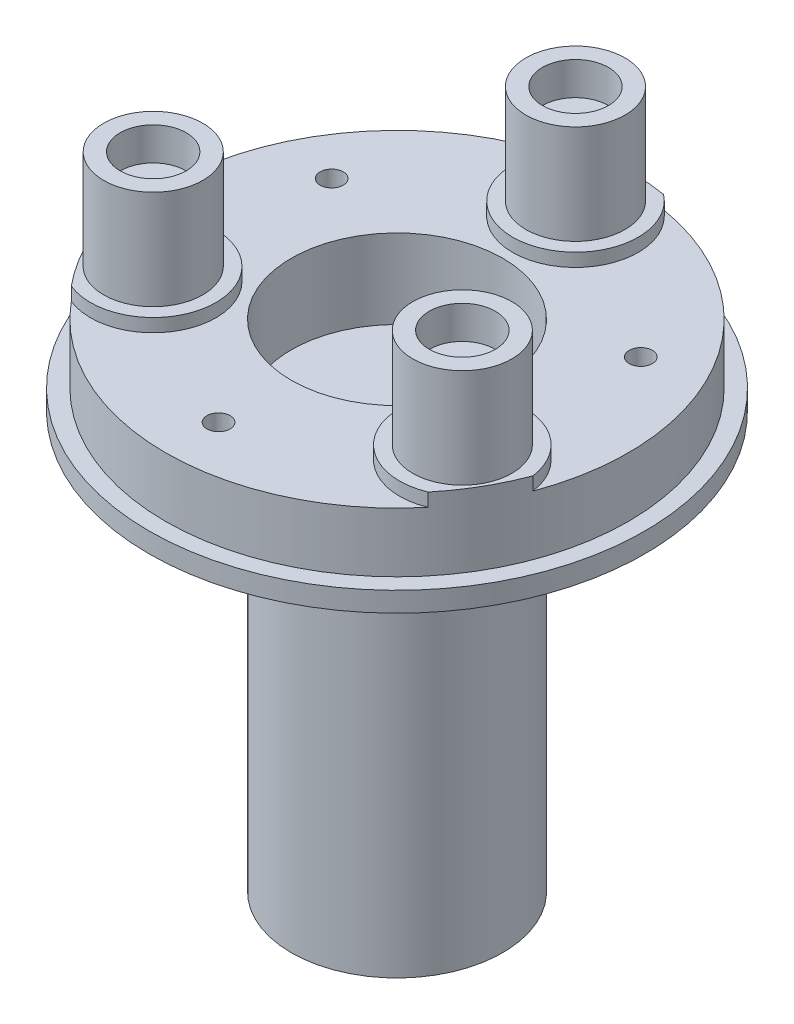
ISO-10303-21;
HEADER;
FILE_DESCRIPTION(('STEP AP214'),'2;1');
FILE_NAME('part.step','',(''),(''),'','','');
FILE_SCHEMA(('AUTOMOTIVE_DESIGN { 1 0 10303 214 1 1 1 1 }'));
ENDSEC;
DATA;
#1=APPLICATION_CONTEXT('core data for automotive mechanical design processes');
#2=APPLICATION_PROTOCOL_DEFINITION('international standard','automotive_design',2000,#1);
#3=PRODUCT_CONTEXT('',#1,'mechanical');
#4=PRODUCT('Part','Part','',(#3));
#5=PRODUCT_RELATED_PRODUCT_CATEGORY('part','',(#4));
#6=PRODUCT_DEFINITION_FORMATION('','',#4);
#7=PRODUCT_DEFINITION_CONTEXT('part definition',#1,'design');
#8=PRODUCT_DEFINITION('design','',#6,#7);
#9=PRODUCT_DEFINITION_SHAPE('','',#8);
#10=(LENGTH_UNIT() NAMED_UNIT(*) SI_UNIT(.MILLI.,.METRE.));
#11=(NAMED_UNIT(*) PLANE_ANGLE_UNIT() SI_UNIT($,.RADIAN.));
#12=(NAMED_UNIT(*) SI_UNIT($,.STERADIAN.) SOLID_ANGLE_UNIT());
#13=UNCERTAINTY_MEASURE_WITH_UNIT(LENGTH_MEASURE(1.E-05),#10,'distance_accuracy_value','');
#14=(GEOMETRIC_REPRESENTATION_CONTEXT(3) GLOBAL_UNCERTAINTY_ASSIGNED_CONTEXT((#13)) GLOBAL_UNIT_ASSIGNED_CONTEXT((#10,
#11,#12)) REPRESENTATION_CONTEXT('',''));
#15=CARTESIAN_POINT('',(0.,0.,0.));
#16=DIRECTION('',(0.,0.,1.));
#17=DIRECTION('',(1.,0.,0.));
#18=AXIS2_PLACEMENT_3D('',#15,#16,#17);
#19=CARTESIAN_POINT('',(0.,-63.,0.));
#20=DIRECTION('',(0.,1.,0.));
#21=DIRECTION('',(0.,0.,1.));
#22=AXIS2_PLACEMENT_3D('',#19,#20,#21);
#23=CYLINDRICAL_SURFACE('',#22,16.);
#24=CARTESIAN_POINT('',(0.,-63.,0.));
#25=DIRECTION('',(0.,-1.,0.));
#26=DIRECTION('',(0.,0.,-1.));
#27=AXIS2_PLACEMENT_3D('',#24,#25,#26);
#28=CIRCLE('',#27,16.);
#29=CARTESIAN_POINT('',(0.,-63.,-16.));
#30=VERTEX_POINT('',#29);
#31=EDGE_CURVE('E11',#30,#30,#28,.T.);
#32=ORIENTED_EDGE('',*,*,#31,.F.);
#33=EDGE_LOOP('',(#32));
#34=FACE_BOUND('',#33,.T.);
#35=CARTESIAN_POINT('',(0.,0.,0.));
#36=DIRECTION('',(0.,-1.,0.));
#37=DIRECTION('',(0.,0.,-1.));
#38=AXIS2_PLACEMENT_3D('',#35,#36,#37);
#39=CIRCLE('',#38,16.);
#40=CARTESIAN_POINT('',(0.,0.,-16.));
#41=VERTEX_POINT('',#40);
#42=EDGE_CURVE('E50',#41,#41,#39,.T.);
#43=ORIENTED_EDGE('',*,*,#42,.T.);
#44=EDGE_LOOP('',(#43));
#45=FACE_BOUND('',#44,.T.);
#46=ADVANCED_FACE('F47',(#34,#45),#23,.T.);
#47=CARTESIAN_POINT('',(0.,-63.,0.));
#48=DIRECTION('',(0.,-1.,0.));
#49=DIRECTION('',(0.,0.,-1.));
#50=AXIS2_PLACEMENT_3D('',#47,#48,#49);
#51=PLANE('',#50);
#52=ORIENTED_EDGE('',*,*,#31,.T.);
#53=EDGE_LOOP('',(#52));
#54=FACE_BOUND('',#53,.T.);
#55=ADVANCED_FACE('F62',(#54),#51,.T.);
#56=CARTESIAN_POINT('',(0.,0.,0.));
#57=DIRECTION('',(0.,-1.,0.));
#58=DIRECTION('',(0.,0.,-1.));
#59=AXIS2_PLACEMENT_3D('',#56,#57,#58);
#60=PLANE('',#59);
#61=ORIENTED_EDGE('',*,*,#42,.F.);
#62=EDGE_LOOP('',(#61));
#63=FACE_BOUND('',#62,.T.);
#64=ADVANCED_FACE('F60',(#63),#60,.F.);
#65=CLOSED_SHELL('',(#46,#55,#64));
#66=MANIFOLD_SOLID_BREP('B2',#65);
#67=CARTESIAN_POINT('',(0.,3.,0.));
#68=DIRECTION('',(0.,-1.,0.));
#69=DIRECTION('',(0.,0.,-1.));
#70=AXIS2_PLACEMENT_3D('',#67,#68,#69);
#71=CYLINDRICAL_SURFACE('',#70,37.5);
#72=CARTESIAN_POINT('',(0.,3.,0.));
#73=DIRECTION('',(0.,1.,0.));
#74=DIRECTION('',(0.,0.,1.));
#75=AXIS2_PLACEMENT_3D('',#72,#73,#74);
#76=CIRCLE('',#75,37.5);
#77=CARTESIAN_POINT('',(0.,3.,37.5));
#78=VERTEX_POINT('',#77);
#79=EDGE_CURVE('E45',#78,#78,#76,.T.);
#80=ORIENTED_EDGE('',*,*,#79,.F.);
#81=EDGE_LOOP('',(#80));
#82=FACE_BOUND('',#81,.T.);
#83=CARTESIAN_POINT('',(0.,0.,0.));
#84=DIRECTION('',(0.,1.,0.));
#85=DIRECTION('',(0.,0.,1.));
#86=AXIS2_PLACEMENT_3D('',#83,#84,#85);
#87=CIRCLE('',#86,37.5);
#88=CARTESIAN_POINT('',(0.,0.,37.5));
#89=VERTEX_POINT('',#88);
#90=EDGE_CURVE('E98',#89,#89,#87,.T.);
#91=ORIENTED_EDGE('',*,*,#90,.T.);
#92=EDGE_LOOP('',(#91));
#93=FACE_BOUND('',#92,.T.);
#94=ADVANCED_FACE('F90',(#82,#93),#71,.T.);
#95=CARTESIAN_POINT('',(0.,3.,0.));
#96=DIRECTION('',(0.,1.,0.));
#97=DIRECTION('',(0.,0.,1.));
#98=AXIS2_PLACEMENT_3D('',#95,#96,#97);
#99=PLANE('',#98);
#100=CARTESIAN_POINT('',(0.,3.,0.));
#101=DIRECTION('',(0.,1.,0.));
#102=DIRECTION('',(0.,0.,1.));
#103=AXIS2_PLACEMENT_3D('',#100,#101,#102);
#104=CIRCLE('',#103,35.);
#105=CARTESIAN_POINT('',(0.,3.,35.));
#106=VERTEX_POINT('',#105);
#107=EDGE_CURVE('E199',#106,#106,#104,.F.);
#108=ORIENTED_EDGE('',*,*,#107,.T.);
#109=EDGE_LOOP('',(#108));
#110=FACE_BOUND('',#109,.T.);
#111=ORIENTED_EDGE('',*,*,#79,.T.);
#112=EDGE_LOOP('',(#111));
#113=FACE_BOUND('',#112,.T.);
#114=ADVANCED_FACE('F293',(#110,#113),#99,.T.);
#115=CARTESIAN_POINT('',(0.,0.,0.));
#116=DIRECTION('',(0.,1.,0.));
#117=DIRECTION('',(0.,0.,1.));
#118=AXIS2_PLACEMENT_3D('',#115,#116,#117);
#119=PLANE('',#118);
#120=CARTESIAN_POINT('',(23.3826859021799,0.,-13.4999999999999));
#121=DIRECTION('',(0.,1.,0.));
#122=DIRECTION('',(0.,0.,1.));
#123=AXIS2_PLACEMENT_3D('',#120,#121,#122);
#124=CIRCLE('',#123,1.75);
#125=CARTESIAN_POINT('',(23.3826859021799,0.,-11.7499999999999));
#126=VERTEX_POINT('',#125);
#127=EDGE_CURVE('E657',#126,#126,#124,.T.);
#128=ORIENTED_EDGE('',*,*,#127,.T.);
#129=EDGE_LOOP('',(#128));
#130=FACE_BOUND('',#129,.T.);
#131=CARTESIAN_POINT('',(1.62490074036202E-12,0.,27.000000000001));
#132=DIRECTION('',(0.,1.,0.));
#133=DIRECTION('',(0.,0.,1.));
#134=AXIS2_PLACEMENT_3D('',#131,#132,#133);
#135=CIRCLE('',#134,1.75);
#136=CARTESIAN_POINT('',(1.62490074036202E-12,0.,28.750000000001));
#137=VERTEX_POINT('',#136);
#138=EDGE_CURVE('E661',#137,#137,#135,.T.);
#139=ORIENTED_EDGE('',*,*,#138,.T.);
#140=EDGE_LOOP('',(#139));
#141=FACE_BOUND('',#140,.T.);
#142=CARTESIAN_POINT('',(-23.3826859021798,0.,-13.4999999999981));
#143=DIRECTION('',(0.,1.,0.));
#144=DIRECTION('',(0.,0.,1.));
#145=AXIS2_PLACEMENT_3D('',#142,#143,#144);
#146=CIRCLE('',#145,1.75);
#147=CARTESIAN_POINT('',(-23.3826859021798,0.,-11.7499999999981));
#148=VERTEX_POINT('',#147);
#149=EDGE_CURVE('E671',#148,#148,#146,.T.);
#150=ORIENTED_EDGE('',*,*,#149,.T.);
#151=EDGE_LOOP('',(#150));
#152=FACE_BOUND('',#151,.T.);
#153=CARTESIAN_POINT('',(0.,0.,-27.));
#154=DIRECTION('',(0.,-1.,0.));
#155=DIRECTION('',(0.,0.,-1.));
#156=AXIS2_PLACEMENT_3D('',#153,#154,#155);
#157=CIRCLE('',#156,3.525);
#158=CARTESIAN_POINT('',(0.,0.,-30.525));
#159=VERTEX_POINT('',#158);
#160=EDGE_CURVE('E663',#159,#159,#157,.T.);
#161=ORIENTED_EDGE('',*,*,#160,.F.);
#162=EDGE_LOOP('',(#161));
#163=FACE_BOUND('',#162,.T.);
#164=CARTESIAN_POINT('',(-23.3826859021816,0.,13.499999999999));
#165=DIRECTION('',(0.,-1.,0.));
#166=DIRECTION('',(0.,0.,-1.));
#167=AXIS2_PLACEMENT_3D('',#164,#165,#166);
#168=CIRCLE('',#167,3.525);
#169=CARTESIAN_POINT('',(-23.3826859021816,0.,9.974999999999));
#170=VERTEX_POINT('',#169);
#171=EDGE_CURVE('E688',#170,#170,#168,.T.);
#172=ORIENTED_EDGE('',*,*,#171,.F.);
#173=EDGE_LOOP('',(#172));
#174=FACE_BOUND('',#173,.T.);
#175=CARTESIAN_POINT('',(23.3826859021781,0.,13.500000000001));
#176=DIRECTION('',(0.,-1.,0.));
#177=DIRECTION('',(0.,0.,-1.));
#178=AXIS2_PLACEMENT_3D('',#175,#176,#177);
#179=CIRCLE('',#178,3.525);
#180=CARTESIAN_POINT('',(23.3826859021781,0.,9.97500000000099));
#181=VERTEX_POINT('',#180);
#182=EDGE_CURVE('E210',#181,#181,#179,.T.);
#183=ORIENTED_EDGE('',*,*,#182,.F.);
#184=EDGE_LOOP('',(#183));
#185=FACE_BOUND('',#184,.T.);
#186=CARTESIAN_POINT('',(0.,0.,0.));
#187=DIRECTION('',(0.,1.,0.));
#188=DIRECTION('',(0.,0.,1.));
#189=AXIS2_PLACEMENT_3D('',#186,#187,#188);
#190=CIRCLE('',#189,16.);
#191=CARTESIAN_POINT('',(0.,0.,16.));
#192=VERTEX_POINT('',#191);
#193=EDGE_CURVE('E190',#192,#192,#190,.T.);
#194=ORIENTED_EDGE('',*,*,#193,.T.);
#195=EDGE_LOOP('',(#194));
#196=FACE_BOUND('',#195,.T.);
#197=ORIENTED_EDGE('',*,*,#90,.F.);
#198=EDGE_LOOP('',(#197));
#199=FACE_BOUND('',#198,.T.);
#200=ADVANCED_FACE('F298',(#130,#141,#152,#163,#174,#185,#196,#199),#119,.F.);
#201=CARTESIAN_POINT('',(0.,12.,0.));
#202=DIRECTION('',(0.,-1.,0.));
#203=DIRECTION('',(0.,0.,-1.));
#204=AXIS2_PLACEMENT_3D('',#201,#202,#203);
#205=CYLINDRICAL_SURFACE('',#204,35.);
#206=ORIENTED_EDGE('',*,*,#107,.F.);
#207=EDGE_LOOP('',(#206));
#208=FACE_BOUND('',#207,.T.);
#209=CARTESIAN_POINT('',(0.,12.,0.));
#210=DIRECTION('',(0.,1.,0.));
#211=DIRECTION('',(0.,0.,1.));
#212=AXIS2_PLACEMENT_3D('',#209,#210,#211);
#213=CIRCLE('',#212,35.);
#214=CARTESIAN_POINT('',(-26.9833828527782,12.,22.291187716683));
#215=VERTEX_POINT('',#214);
#216=CARTESIAN_POINT('',(26.983382852779,12.,22.291187716682));
#217=VERTEX_POINT('',#216);
#218=EDGE_CURVE('E196',#215,#217,#213,.T.);
#219=ORIENTED_EDGE('',*,*,#218,.F.);
#220=DIRECTION('',(0.,-1.,0.));
#221=VECTOR('',#220,1.);
#222=CARTESIAN_POINT('',(-26.9833828527782,14.,22.291187716683));
#223=LINE('',#222,#221);
#224=CARTESIAN_POINT('',(-26.9833828527782,14.,22.291187716683));
#225=VERTEX_POINT('',#224);
#226=EDGE_CURVE('E186',#225,#215,#223,.T.);
#227=ORIENTED_EDGE('',*,*,#226,.F.);
#228=CARTESIAN_POINT('',(0.,14.,0.));
#229=DIRECTION('',(0.,1.,0.));
#230=DIRECTION('',(0.,0.,1.));
#231=AXIS2_PLACEMENT_3D('',#228,#229,#230);
#232=CIRCLE('',#231,35.);
#233=CARTESIAN_POINT('',(-32.7964262695624,14.,12.2227011722105));
#234=VERTEX_POINT('',#233);
#235=EDGE_CURVE('E176',#234,#225,#232,.T.);
#236=ORIENTED_EDGE('',*,*,#235,.F.);
#237=DIRECTION('',(0.,-1.,0.));
#238=VECTOR('',#237,1.);
#239=CARTESIAN_POINT('',(-32.7964262695624,14.,12.2227011722105));
#240=LINE('',#239,#238);
#241=CARTESIAN_POINT('',(-32.7964262695624,12.,12.2227011722105));
#242=VERTEX_POINT('',#241);
#243=EDGE_CURVE('E181',#234,#242,#240,.T.);
#244=ORIENTED_EDGE('',*,*,#243,.T.);
#245=CARTESIAN_POINT('',(-5.81304341678534,12.,-34.5138888888889));
#246=VERTEX_POINT('',#245);
#247=EDGE_CURVE('E193',#246,#242,#213,.T.);
#248=ORIENTED_EDGE('',*,*,#247,.F.);
#249=DIRECTION('',(0.,-1.,0.));
#250=VECTOR('',#249,1.);
#251=CARTESIAN_POINT('',(-5.81304341678534,14.,-34.5138888888889));
#252=LINE('',#251,#250);
#253=CARTESIAN_POINT('',(-5.81304341678534,14.,-34.5138888888889));
#254=VERTEX_POINT('',#253);
#255=EDGE_CURVE('E114',#254,#246,#252,.T.);
#256=ORIENTED_EDGE('',*,*,#255,.F.);
#257=CARTESIAN_POINT('',(0.,14.,0.));
#258=DIRECTION('',(0.,1.,0.));
#259=DIRECTION('',(0.,0.,1.));
#260=AXIS2_PLACEMENT_3D('',#257,#258,#259);
#261=CIRCLE('',#260,35.);
#262=CARTESIAN_POINT('',(5.81304341678534,14.,-34.5138888888889));
#263=VERTEX_POINT('',#262);
#264=EDGE_CURVE('E163',#263,#254,#261,.T.);
#265=ORIENTED_EDGE('',*,*,#264,.F.);
#266=DIRECTION('',(0.,-1.,0.));
#267=VECTOR('',#266,1.);
#268=CARTESIAN_POINT('',(5.81304341678534,14.,-34.5138888888889));
#269=LINE('',#268,#267);
#270=CARTESIAN_POINT('',(5.81304341678534,12.,-34.5138888888889));
#271=VERTEX_POINT('',#270);
#272=EDGE_CURVE('E171',#263,#271,#269,.T.);
#273=ORIENTED_EDGE('',*,*,#272,.T.);
#274=CARTESIAN_POINT('',(32.7964262695655,12.,12.2227011722024));
#275=VERTEX_POINT('',#274);
#276=EDGE_CURVE('E160',#275,#271,#213,.T.);
#277=ORIENTED_EDGE('',*,*,#276,.F.);
#278=DIRECTION('',(0.,-1.,0.));
#279=VECTOR('',#278,1.);
#280=CARTESIAN_POINT('',(32.7964262695655,14.,12.2227011722024));
#281=LINE('',#280,#279);
#282=CARTESIAN_POINT('',(32.7964262695655,14.,12.2227011722024));
#283=VERTEX_POINT('',#282);
#284=EDGE_CURVE('E106',#283,#275,#281,.T.);
#285=ORIENTED_EDGE('',*,*,#284,.F.);
#286=CARTESIAN_POINT('',(0.,14.,0.));
#287=DIRECTION('',(0.,1.,0.));
#288=DIRECTION('',(0.,0.,1.));
#289=AXIS2_PLACEMENT_3D('',#286,#287,#288);
#290=CIRCLE('',#289,35.);
#291=CARTESIAN_POINT('',(26.983382852779,14.,22.291187716682));
#292=VERTEX_POINT('',#291);
#293=EDGE_CURVE('E150',#292,#283,#290,.T.);
#294=ORIENTED_EDGE('',*,*,#293,.F.);
#295=DIRECTION('',(0.,-1.,0.));
#296=VECTOR('',#295,1.);
#297=CARTESIAN_POINT('',(26.983382852779,14.,22.291187716682));
#298=LINE('',#297,#296);
#299=EDGE_CURVE('E147',#292,#217,#298,.T.);
#300=ORIENTED_EDGE('',*,*,#299,.T.);
#301=EDGE_LOOP('',(#219,#227,#236,#244,#248,#256,#265,#273,#277,#285,#294,#300));
#302=FACE_BOUND('',#301,.T.);
#303=ADVANCED_FACE('F158',(#208,#302),#205,.T.);
#304=CARTESIAN_POINT('',(0.,12.,0.));
#305=DIRECTION('',(0.,1.,0.));
#306=DIRECTION('',(0.,0.,1.));
#307=AXIS2_PLACEMENT_3D('',#304,#305,#306);
#308=PLANE('',#307);
#309=CARTESIAN_POINT('',(23.3826859021799,12.,-13.4999999999999));
#310=DIRECTION('',(0.,1.,0.));
#311=DIRECTION('',(0.,0.,1.));
#312=AXIS2_PLACEMENT_3D('',#309,#310,#311);
#313=CIRCLE('',#312,1.75);
#314=CARTESIAN_POINT('',(23.3826859021799,12.,-11.7499999999999));
#315=VERTEX_POINT('',#314);
#316=EDGE_CURVE('E660',#315,#315,#313,.T.);
#317=ORIENTED_EDGE('',*,*,#316,.F.);
#318=EDGE_LOOP('',(#317));
#319=FACE_BOUND('',#318,.T.);
#320=CARTESIAN_POINT('',(1.62490074036202E-12,12.,27.000000000001));
#321=DIRECTION('',(0.,1.,0.));
#322=DIRECTION('',(0.,0.,1.));
#323=AXIS2_PLACEMENT_3D('',#320,#321,#322);
#324=CIRCLE('',#323,1.75);
#325=CARTESIAN_POINT('',(1.62490074036202E-12,12.,28.750000000001));
#326=VERTEX_POINT('',#325);
#327=EDGE_CURVE('E666',#326,#326,#324,.T.);
#328=ORIENTED_EDGE('',*,*,#327,.F.);
#329=EDGE_LOOP('',(#328));
#330=FACE_BOUND('',#329,.T.);
#331=CARTESIAN_POINT('',(-23.3826859021798,12.,-13.4999999999981));
#332=DIRECTION('',(0.,1.,0.));
#333=DIRECTION('',(0.,0.,1.));
#334=AXIS2_PLACEMENT_3D('',#331,#332,#333);
#335=CIRCLE('',#334,1.75);
#336=CARTESIAN_POINT('',(-23.3826859021798,12.,-11.7499999999981));
#337=VERTEX_POINT('',#336);
#338=EDGE_CURVE('E674',#337,#337,#335,.T.);
#339=ORIENTED_EDGE('',*,*,#338,.F.);
#340=EDGE_LOOP('',(#339));
#341=FACE_BOUND('',#340,.T.);
#342=ORIENTED_EDGE('',*,*,#218,.T.);
#343=CARTESIAN_POINT('',(23.3826859021818,12.,13.4999999999989));
#344=DIRECTION('',(0.,1.,0.));
#345=DIRECTION('',(0.,0.,1.));
#346=AXIS2_PLACEMENT_3D('',#343,#344,#345);
#347=CIRCLE('',#346,9.5);
#348=EDGE_CURVE('E154',#275,#217,#347,.T.);
#349=ORIENTED_EDGE('',*,*,#348,.F.);
#350=ORIENTED_EDGE('',*,*,#276,.T.);
#351=CARTESIAN_POINT('',(0.,12.,-27.));
#352=DIRECTION('',(0.,1.,0.));
#353=DIRECTION('',(0.,0.,1.));
#354=AXIS2_PLACEMENT_3D('',#351,#352,#353);
#355=CIRCLE('',#354,9.5);
#356=EDGE_CURVE('E161',#246,#271,#355,.T.);
#357=ORIENTED_EDGE('',*,*,#356,.F.);
#358=ORIENTED_EDGE('',*,*,#247,.T.);
#359=CARTESIAN_POINT('',(-23.3826859021779,12.,13.5000000000011));
#360=DIRECTION('',(0.,1.,0.));
#361=DIRECTION('',(0.,0.,1.));
#362=AXIS2_PLACEMENT_3D('',#359,#360,#361);
#363=CIRCLE('',#362,9.50000000000001);
#364=EDGE_CURVE('E175',#215,#242,#363,.T.);
#365=ORIENTED_EDGE('',*,*,#364,.F.);
#366=EDGE_LOOP('',(#342,#349,#350,#357,#358,#365));
#367=FACE_BOUND('',#366,.T.);
#368=CARTESIAN_POINT('',(0.,12.,0.));
#369=DIRECTION('',(0.,1.,0.));
#370=DIRECTION('',(0.,0.,1.));
#371=AXIS2_PLACEMENT_3D('',#368,#369,#370);
#372=CIRCLE('',#371,16.);
#373=CARTESIAN_POINT('',(0.,12.,16.));
#374=VERTEX_POINT('',#373);
#375=EDGE_CURVE('E189',#374,#374,#372,.T.);
#376=ORIENTED_EDGE('',*,*,#375,.F.);
#377=EDGE_LOOP('',(#376));
#378=FACE_BOUND('',#377,.T.);
#379=ADVANCED_FACE('F270',(#319,#330,#341,#367,#378),#308,.T.);
#380=CARTESIAN_POINT('',(0.,0.,0.));
#381=DIRECTION('',(0.,1.,0.));
#382=DIRECTION('',(0.,0.,1.));
#383=AXIS2_PLACEMENT_3D('',#380,#381,#382);
#384=CYLINDRICAL_SURFACE('',#383,16.);
#385=ORIENTED_EDGE('',*,*,#193,.F.);
#386=EDGE_LOOP('',(#385));
#387=FACE_BOUND('',#386,.T.);
#388=ORIENTED_EDGE('',*,*,#375,.T.);
#389=EDGE_LOOP('',(#388));
#390=FACE_BOUND('',#389,.T.);
#391=ADVANCED_FACE('F289',(#387,#390),#384,.F.);
#392=CARTESIAN_POINT('',(-23.3826859021779,14.,13.5000000000011));
#393=DIRECTION('',(0.,-1.,0.));
#394=DIRECTION('',(0.,0.,-1.));
#395=AXIS2_PLACEMENT_3D('',#392,#393,#394);
#396=CYLINDRICAL_SURFACE('',#395,9.50000000000001);
#397=ORIENTED_EDGE('',*,*,#364,.T.);
#398=ORIENTED_EDGE('',*,*,#243,.F.);
#399=CARTESIAN_POINT('',(-23.3826859021779,14.,13.5000000000011));
#400=DIRECTION('',(0.,1.,0.));
#401=DIRECTION('',(0.,0.,1.));
#402=AXIS2_PLACEMENT_3D('',#399,#400,#401);
#403=CIRCLE('',#402,9.50000000000001);
#404=EDGE_CURVE('E179',#225,#234,#403,.T.);
#405=ORIENTED_EDGE('',*,*,#404,.F.);
#406=ORIENTED_EDGE('',*,*,#226,.T.);
#407=EDGE_LOOP('',(#397,#398,#405,#406));
#408=FACE_BOUND('',#407,.T.);
#409=ADVANCED_FACE('F275',(#408),#396,.T.);
#410=CARTESIAN_POINT('',(0.,14.,0.));
#411=DIRECTION('',(0.,1.,0.));
#412=DIRECTION('',(0.,0.,1.));
#413=AXIS2_PLACEMENT_3D('',#410,#411,#412);
#414=PLANE('',#413);
#415=CARTESIAN_POINT('',(-23.3826859021781,14.,13.500000000001));
#416=DIRECTION('',(0.,1.,0.));
#417=DIRECTION('',(0.,0.,1.));
#418=AXIS2_PLACEMENT_3D('',#415,#416,#417);
#419=CIRCLE('',#418,7.50000000000218);
#420=CARTESIAN_POINT('',(-23.3826859021781,14.,21.0000000000032));
#421=VERTEX_POINT('',#420);
#422=EDGE_CURVE('E237',#421,#421,#419,.T.);
#423=ORIENTED_EDGE('',*,*,#422,.F.);
#424=EDGE_LOOP('',(#423));
#425=FACE_BOUND('',#424,.T.);
#426=ORIENTED_EDGE('',*,*,#235,.T.);
#427=ORIENTED_EDGE('',*,*,#404,.T.);
#428=EDGE_LOOP('',(#426,#427));
#429=FACE_BOUND('',#428,.T.);
#430=ADVANCED_FACE('F278',(#425,#429),#414,.T.);
#431=CARTESIAN_POINT('',(0.,14.,-27.));
#432=DIRECTION('',(0.,-1.,0.));
#433=DIRECTION('',(0.,0.,-1.));
#434=AXIS2_PLACEMENT_3D('',#431,#432,#433);
#435=CYLINDRICAL_SURFACE('',#434,9.5);
#436=ORIENTED_EDGE('',*,*,#356,.T.);
#437=ORIENTED_EDGE('',*,*,#272,.F.);
#438=CARTESIAN_POINT('',(0.,14.,-27.));
#439=DIRECTION('',(0.,1.,0.));
#440=DIRECTION('',(0.,0.,1.));
#441=AXIS2_PLACEMENT_3D('',#438,#439,#440);
#442=CIRCLE('',#441,9.5);
#443=EDGE_CURVE('E170',#254,#263,#442,.T.);
#444=ORIENTED_EDGE('',*,*,#443,.F.);
#445=ORIENTED_EDGE('',*,*,#255,.T.);
#446=EDGE_LOOP('',(#436,#437,#444,#445));
#447=FACE_BOUND('',#446,.T.);
#448=ADVANCED_FACE('F280',(#447),#435,.T.);
#449=CARTESIAN_POINT('',(0.,14.,0.));
#450=DIRECTION('',(0.,1.,0.));
#451=DIRECTION('',(0.,0.,1.));
#452=AXIS2_PLACEMENT_3D('',#449,#450,#451);
#453=PLANE('',#452);
#454=CARTESIAN_POINT('',(0.,14.,-27.));
#455=DIRECTION('',(0.,1.,0.));
#456=DIRECTION('',(0.,0.,1.));
#457=AXIS2_PLACEMENT_3D('',#454,#455,#456);
#458=CIRCLE('',#457,7.5);
#459=CARTESIAN_POINT('',(0.,14.,-19.5));
#460=VERTEX_POINT('',#459);
#461=EDGE_CURVE('E261',#460,#460,#458,.T.);
#462=ORIENTED_EDGE('',*,*,#461,.F.);
#463=EDGE_LOOP('',(#462));
#464=FACE_BOUND('',#463,.T.);
#465=ORIENTED_EDGE('',*,*,#264,.T.);
#466=ORIENTED_EDGE('',*,*,#443,.T.);
#467=EDGE_LOOP('',(#465,#466));
#468=FACE_BOUND('',#467,.T.);
#469=ADVANCED_FACE('F287',(#464,#468),#453,.T.);
#470=CARTESIAN_POINT('',(23.3826859021818,14.,13.4999999999989));
#471=DIRECTION('',(0.,-1.,0.));
#472=DIRECTION('',(0.,0.,-1.));
#473=AXIS2_PLACEMENT_3D('',#470,#471,#472);
#474=CYLINDRICAL_SURFACE('',#473,9.5);
#475=ORIENTED_EDGE('',*,*,#348,.T.);
#476=ORIENTED_EDGE('',*,*,#299,.F.);
#477=CARTESIAN_POINT('',(23.3826859021818,14.,13.4999999999989));
#478=DIRECTION('',(0.,1.,0.));
#479=DIRECTION('',(0.,0.,1.));
#480=AXIS2_PLACEMENT_3D('',#477,#478,#479);
#481=CIRCLE('',#480,9.5);
#482=EDGE_CURVE('E143',#283,#292,#481,.T.);
#483=ORIENTED_EDGE('',*,*,#482,.F.);
#484=ORIENTED_EDGE('',*,*,#284,.T.);
#485=EDGE_LOOP('',(#475,#476,#483,#484));
#486=FACE_BOUND('',#485,.T.);
#487=ADVANCED_FACE('F145',(#486),#474,.T.);
#488=CARTESIAN_POINT('',(0.,14.,0.));
#489=DIRECTION('',(0.,1.,0.));
#490=DIRECTION('',(0.,0.,1.));
#491=AXIS2_PLACEMENT_3D('',#488,#489,#490);
#492=PLANE('',#491);
#493=CARTESIAN_POINT('',(23.3826859021816,14.,13.499999999999));
#494=DIRECTION('',(0.,1.,0.));
#495=DIRECTION('',(0.,0.,1.));
#496=AXIS2_PLACEMENT_3D('',#493,#494,#495);
#497=CIRCLE('',#496,7.50000000000147);
#498=CARTESIAN_POINT('',(23.3826859021816,14.,21.0000000000005));
#499=VERTEX_POINT('',#498);
#500=EDGE_CURVE('E255',#499,#499,#497,.T.);
#501=ORIENTED_EDGE('',*,*,#500,.F.);
#502=EDGE_LOOP('',(#501));
#503=FACE_BOUND('',#502,.T.);
#504=ORIENTED_EDGE('',*,*,#293,.T.);
#505=ORIENTED_EDGE('',*,*,#482,.T.);
#506=EDGE_LOOP('',(#504,#505));
#507=FACE_BOUND('',#506,.T.);
#508=ADVANCED_FACE('F152',(#503,#507),#492,.T.);
#509=CARTESIAN_POINT('',(0.,29.,-27.));
#510=DIRECTION('',(0.,-1.,0.));
#511=DIRECTION('',(0.,0.,-1.));
#512=AXIS2_PLACEMENT_3D('',#509,#510,#511);
#513=CYLINDRICAL_SURFACE('',#512,7.5);
#514=CARTESIAN_POINT('',(0.,29.,-27.));
#515=DIRECTION('',(0.,1.,0.));
#516=DIRECTION('',(0.,0.,1.));
#517=AXIS2_PLACEMENT_3D('',#514,#515,#516);
#518=CIRCLE('',#517,7.5);
#519=CARTESIAN_POINT('',(0.,29.,-19.5));
#520=VERTEX_POINT('',#519);
#521=EDGE_CURVE('E264',#520,#520,#518,.T.);
#522=ORIENTED_EDGE('',*,*,#521,.F.);
#523=EDGE_LOOP('',(#522));
#524=FACE_BOUND('',#523,.T.);
#525=ORIENTED_EDGE('',*,*,#461,.T.);
#526=EDGE_LOOP('',(#525));
#527=FACE_BOUND('',#526,.T.);
#528=ADVANCED_FACE('F372',(#524,#527),#513,.T.);
#529=CARTESIAN_POINT('',(0.,29.,-27.));
#530=DIRECTION('',(0.,1.,0.));
#531=DIRECTION('',(0.,0.,1.));
#532=AXIS2_PLACEMENT_3D('',#529,#530,#531);
#533=PLANE('',#532);
#534=CARTESIAN_POINT('',(0.,29.,-27.));
#535=DIRECTION('',(0.,1.,0.));
#536=DIRECTION('',(0.,0.,1.));
#537=AXIS2_PLACEMENT_3D('',#534,#535,#536);
#538=CIRCLE('',#537,5.);
#539=CARTESIAN_POINT('',(0.,29.,-22.));
#540=VERTEX_POINT('',#539);
#541=EDGE_CURVE('E238',#540,#540,#538,.T.);
#542=ORIENTED_EDGE('',*,*,#541,.F.);
#543=EDGE_LOOP('',(#542));
#544=FACE_BOUND('',#543,.T.);
#545=ORIENTED_EDGE('',*,*,#521,.T.);
#546=EDGE_LOOP('',(#545));
#547=FACE_BOUND('',#546,.T.);
#548=ADVANCED_FACE('F382',(#544,#547),#533,.T.);
#549=CARTESIAN_POINT('',(23.3826859021816,29.,13.499999999999));
#550=DIRECTION('',(0.,-1.,0.));
#551=DIRECTION('',(0.,0.,-1.));
#552=AXIS2_PLACEMENT_3D('',#549,#550,#551);
#553=CYLINDRICAL_SURFACE('',#552,7.50000000000147);
#554=CARTESIAN_POINT('',(23.3826859021816,29.,13.499999999999));
#555=DIRECTION('',(0.,1.,0.));
#556=DIRECTION('',(0.,0.,1.));
#557=AXIS2_PLACEMENT_3D('',#554,#555,#556);
#558=CIRCLE('',#557,7.50000000000147);
#559=CARTESIAN_POINT('',(23.3826859021816,29.,21.0000000000005));
#560=VERTEX_POINT('',#559);
#561=EDGE_CURVE('E258',#560,#560,#558,.T.);
#562=ORIENTED_EDGE('',*,*,#561,.F.);
#563=EDGE_LOOP('',(#562));
#564=FACE_BOUND('',#563,.T.);
#565=ORIENTED_EDGE('',*,*,#500,.T.);
#566=EDGE_LOOP('',(#565));
#567=FACE_BOUND('',#566,.T.);
#568=ADVANCED_FACE('F390',(#564,#567),#553,.T.);
#569=CARTESIAN_POINT('',(23.3826859021816,29.,13.499999999999));
#570=DIRECTION('',(0.,1.,0.));
#571=DIRECTION('',(0.,0.,1.));
#572=AXIS2_PLACEMENT_3D('',#569,#570,#571);
#573=PLANE('',#572);
#574=CARTESIAN_POINT('',(23.382685902181,29.,13.4999999999993));
#575=DIRECTION('',(0.,1.,0.));
#576=DIRECTION('',(0.,0.,1.));
#577=AXIS2_PLACEMENT_3D('',#574,#575,#576);
#578=CIRCLE('',#577,5.00000000000102);
#579=CARTESIAN_POINT('',(23.382685902181,29.,18.5000000000004));
#580=VERTEX_POINT('',#579);
#581=EDGE_CURVE('E244',#580,#580,#578,.T.);
#582=ORIENTED_EDGE('',*,*,#581,.F.);
#583=EDGE_LOOP('',(#582));
#584=FACE_BOUND('',#583,.T.);
#585=ORIENTED_EDGE('',*,*,#561,.T.);
#586=EDGE_LOOP('',(#585));
#587=FACE_BOUND('',#586,.T.);
#588=ADVANCED_FACE('F395',(#584,#587),#573,.T.);
#589=CARTESIAN_POINT('',(-23.3826859021781,29.,13.500000000001));
#590=DIRECTION('',(0.,-1.,0.));
#591=DIRECTION('',(0.,0.,-1.));
#592=AXIS2_PLACEMENT_3D('',#589,#590,#591);
#593=CYLINDRICAL_SURFACE('',#592,7.50000000000218);
#594=CARTESIAN_POINT('',(-23.3826859021781,29.,13.500000000001));
#595=DIRECTION('',(0.,1.,0.));
#596=DIRECTION('',(0.,0.,1.));
#597=AXIS2_PLACEMENT_3D('',#594,#595,#596);
#598=CIRCLE('',#597,7.50000000000218);
#599=CARTESIAN_POINT('',(-23.3826859021781,29.,21.0000000000032));
#600=VERTEX_POINT('',#599);
#601=EDGE_CURVE('E252',#600,#600,#598,.T.);
#602=ORIENTED_EDGE('',*,*,#601,.F.);
#603=EDGE_LOOP('',(#602));
#604=FACE_BOUND('',#603,.T.);
#605=ORIENTED_EDGE('',*,*,#422,.T.);
#606=EDGE_LOOP('',(#605));
#607=FACE_BOUND('',#606,.T.);
#608=ADVANCED_FACE('F403',(#604,#607),#593,.T.);
#609=CARTESIAN_POINT('',(-23.3826859021781,29.,13.500000000001));
#610=DIRECTION('',(0.,1.,0.));
#611=DIRECTION('',(0.,0.,1.));
#612=AXIS2_PLACEMENT_3D('',#609,#610,#611);
#613=PLANE('',#612);
#614=CARTESIAN_POINT('',(-23.3826859021787,29.,13.5000000000007));
#615=DIRECTION('',(0.,1.,0.));
#616=DIRECTION('',(0.,0.,1.));
#617=AXIS2_PLACEMENT_3D('',#614,#615,#616);
#618=CIRCLE('',#617,5.00000000000154);
#619=CARTESIAN_POINT('',(-23.3826859021787,29.,18.5000000000022));
#620=VERTEX_POINT('',#619);
#621=EDGE_CURVE('E206',#620,#620,#618,.T.);
#622=ORIENTED_EDGE('',*,*,#621,.F.);
#623=EDGE_LOOP('',(#622));
#624=FACE_BOUND('',#623,.T.);
#625=ORIENTED_EDGE('',*,*,#601,.T.);
#626=EDGE_LOOP('',(#625));
#627=FACE_BOUND('',#626,.T.);
#628=ADVANCED_FACE('F408',(#624,#627),#613,.T.);
#629=CARTESIAN_POINT('',(-23.3826859021787,24.,13.5000000000007));
#630=DIRECTION('',(0.,1.,0.));
#631=DIRECTION('',(0.,0.,1.));
#632=AXIS2_PLACEMENT_3D('',#629,#630,#631);
#633=CYLINDRICAL_SURFACE('',#632,5.00000000000154);
#634=CARTESIAN_POINT('',(-23.3826859021787,24.,13.5000000000007));
#635=DIRECTION('',(0.,1.,0.));
#636=DIRECTION('',(0.,0.,1.));
#637=AXIS2_PLACEMENT_3D('',#634,#635,#636);
#638=CIRCLE('',#637,5.00000000000154);
#639=CARTESIAN_POINT('',(-23.3826859021787,24.,18.5000000000022));
#640=VERTEX_POINT('',#639);
#641=EDGE_CURVE('E247',#640,#640,#638,.T.);
#642=ORIENTED_EDGE('',*,*,#641,.F.);
#643=EDGE_LOOP('',(#642));
#644=FACE_BOUND('',#643,.T.);
#645=ORIENTED_EDGE('',*,*,#621,.T.);
#646=EDGE_LOOP('',(#645));
#647=FACE_BOUND('',#646,.T.);
#648=ADVANCED_FACE('F432',(#644,#647),#633,.F.);
#649=CARTESIAN_POINT('',(-23.3826859021787,24.,13.5000000000007));
#650=DIRECTION('',(0.,1.,0.));
#651=DIRECTION('',(0.,0.,1.));
#652=AXIS2_PLACEMENT_3D('',#649,#650,#651);
#653=PLANE('',#652);
#654=CARTESIAN_POINT('',(-23.3826859021816,24.,13.499999999999));
#655=DIRECTION('',(0.,1.,0.));
#656=DIRECTION('',(0.,0.,1.));
#657=AXIS2_PLACEMENT_3D('',#654,#655,#656);
#658=CIRCLE('',#657,1.8);
#659=CARTESIAN_POINT('',(-23.3826859021816,24.,15.299999999999));
#660=VERTEX_POINT('',#659);
#661=EDGE_CURVE('E208',#660,#660,#658,.T.);
#662=ORIENTED_EDGE('',*,*,#661,.F.);
#663=EDGE_LOOP('',(#662));
#664=FACE_BOUND('',#663,.T.);
#665=ORIENTED_EDGE('',*,*,#641,.T.);
#666=EDGE_LOOP('',(#665));
#667=FACE_BOUND('',#666,.T.);
#668=ADVANCED_FACE('F442',(#664,#667),#653,.T.);
#669=CARTESIAN_POINT('',(23.382685902181,24.,13.4999999999993));
#670=DIRECTION('',(0.,1.,0.));
#671=DIRECTION('',(0.,0.,1.));
#672=AXIS2_PLACEMENT_3D('',#669,#670,#671);
#673=CYLINDRICAL_SURFACE('',#672,5.00000000000102);
#674=CARTESIAN_POINT('',(23.382685902181,24.,13.4999999999993));
#675=DIRECTION('',(0.,1.,0.));
#676=DIRECTION('',(0.,0.,1.));
#677=AXIS2_PLACEMENT_3D('',#674,#675,#676);
#678=CIRCLE('',#677,5.00000000000102);
#679=CARTESIAN_POINT('',(23.382685902181,24.,18.5000000000004));
#680=VERTEX_POINT('',#679);
#681=EDGE_CURVE('E241',#680,#680,#678,.T.);
#682=ORIENTED_EDGE('',*,*,#681,.F.);
#683=EDGE_LOOP('',(#682));
#684=FACE_BOUND('',#683,.T.);
#685=ORIENTED_EDGE('',*,*,#581,.T.);
#686=EDGE_LOOP('',(#685));
#687=FACE_BOUND('',#686,.T.);
#688=ADVANCED_FACE('F450',(#684,#687),#673,.F.);
#689=CARTESIAN_POINT('',(23.382685902181,24.,13.4999999999993));
#690=DIRECTION('',(0.,1.,0.));
#691=DIRECTION('',(0.,0.,1.));
#692=AXIS2_PLACEMENT_3D('',#689,#690,#691);
#693=PLANE('',#692);
#694=CARTESIAN_POINT('',(23.3826859021781,24.,13.500000000001));
#695=DIRECTION('',(0.,1.,0.));
#696=DIRECTION('',(0.,0.,1.));
#697=AXIS2_PLACEMENT_3D('',#694,#695,#696);
#698=CIRCLE('',#697,1.8);
#699=CARTESIAN_POINT('',(23.3826859021781,24.,15.300000000001));
#700=VERTEX_POINT('',#699);
#701=EDGE_CURVE('E204',#700,#700,#698,.T.);
#702=ORIENTED_EDGE('',*,*,#701,.F.);
#703=EDGE_LOOP('',(#702));
#704=FACE_BOUND('',#703,.T.);
#705=ORIENTED_EDGE('',*,*,#681,.T.);
#706=EDGE_LOOP('',(#705));
#707=FACE_BOUND('',#706,.T.);
#708=ADVANCED_FACE('F455',(#704,#707),#693,.T.);
#709=CARTESIAN_POINT('',(0.,24.,-27.));
#710=DIRECTION('',(0.,1.,0.));
#711=DIRECTION('',(0.,0.,1.));
#712=AXIS2_PLACEMENT_3D('',#709,#710,#711);
#713=CYLINDRICAL_SURFACE('',#712,5.);
#714=CARTESIAN_POINT('',(0.,24.,-27.));
#715=DIRECTION('',(0.,1.,0.));
#716=DIRECTION('',(0.,0.,1.));
#717=AXIS2_PLACEMENT_3D('',#714,#715,#716);
#718=CIRCLE('',#717,5.);
#719=CARTESIAN_POINT('',(0.,24.,-22.));
#720=VERTEX_POINT('',#719);
#721=EDGE_CURVE('E234',#720,#720,#718,.T.);
#722=ORIENTED_EDGE('',*,*,#721,.F.);
#723=EDGE_LOOP('',(#722));
#724=FACE_BOUND('',#723,.T.);
#725=ORIENTED_EDGE('',*,*,#541,.T.);
#726=EDGE_LOOP('',(#725));
#727=FACE_BOUND('',#726,.T.);
#728=ADVANCED_FACE('F463',(#724,#727),#713,.F.);
#729=CARTESIAN_POINT('',(0.,24.,-27.));
#730=DIRECTION('',(0.,1.,0.));
#731=DIRECTION('',(0.,0.,1.));
#732=AXIS2_PLACEMENT_3D('',#729,#730,#731);
#733=PLANE('',#732);
#734=CARTESIAN_POINT('',(0.,24.,-27.));
#735=DIRECTION('',(0.,1.,0.));
#736=DIRECTION('',(0.,0.,1.));
#737=AXIS2_PLACEMENT_3D('',#734,#735,#736);
#738=CIRCLE('',#737,1.8);
#739=CARTESIAN_POINT('',(0.,24.,-25.2));
#740=VERTEX_POINT('',#739);
#741=EDGE_CURVE('E93',#740,#740,#738,.T.);
#742=ORIENTED_EDGE('',*,*,#741,.F.);
#743=EDGE_LOOP('',(#742));
#744=FACE_BOUND('',#743,.T.);
#745=ORIENTED_EDGE('',*,*,#721,.T.);
#746=EDGE_LOOP('',(#745));
#747=FACE_BOUND('',#746,.T.);
#748=ADVANCED_FACE('F468',(#744,#747),#733,.T.);
#749=CARTESIAN_POINT('',(23.3826859021781,0.,13.500000000001));
#750=DIRECTION('',(0.,-1.,0.));
#751=DIRECTION('',(0.,0.,-1.));
#752=AXIS2_PLACEMENT_3D('',#749,#750,#751);
#753=CYLINDRICAL_SURFACE('',#752,1.8);
#754=ORIENTED_EDGE('',*,*,#701,.T.);
#755=EDGE_LOOP('',(#754));
#756=FACE_BOUND('',#755,.T.);
#757=CARTESIAN_POINT('',(23.3826859021781,2.4,13.500000000001));
#758=DIRECTION('',(0.,-1.,0.));
#759=DIRECTION('',(0.,0.,-1.));
#760=AXIS2_PLACEMENT_3D('',#757,#758,#759);
#761=CIRCLE('',#760,1.8);
#762=CARTESIAN_POINT('',(23.3826859021781,2.4,11.700000000001));
#763=VERTEX_POINT('',#762);
#764=EDGE_CURVE('E207',#763,#763,#761,.T.);
#765=ORIENTED_EDGE('',*,*,#764,.T.);
#766=EDGE_LOOP('',(#765));
#767=FACE_BOUND('',#766,.T.);
#768=ADVANCED_FACE('F492',(#756,#767),#753,.F.);
#769=CARTESIAN_POINT('',(26.8826859021781,2.4,13.500000000001));
#770=DIRECTION('',(0.,1.,0.));
#771=DIRECTION('',(0.,0.,1.));
#772=AXIS2_PLACEMENT_3D('',#769,#770,#771);
#773=PLANE('',#772);
#774=ORIENTED_EDGE('',*,*,#764,.F.);
#775=EDGE_LOOP('',(#774));
#776=FACE_BOUND('',#775,.T.);
#777=CARTESIAN_POINT('',(23.3826859021781,2.4,13.500000000001));
#778=DIRECTION('',(0.,-1.,0.));
#779=DIRECTION('',(0.,0.,-1.));
#780=AXIS2_PLACEMENT_3D('',#777,#778,#779);
#781=CIRCLE('',#780,3.5);
#782=CARTESIAN_POINT('',(23.3826859021781,2.4,10.000000000001));
#783=VERTEX_POINT('',#782);
#784=EDGE_CURVE('E229',#783,#783,#781,.T.);
#785=ORIENTED_EDGE('',*,*,#784,.T.);
#786=EDGE_LOOP('',(#785));
#787=FACE_BOUND('',#786,.T.);
#788=ADVANCED_FACE('F502',(#776,#787),#773,.F.);
#789=CARTESIAN_POINT('',(23.3826859021781,0.,13.500000000001));
#790=DIRECTION('',(0.,-1.,0.));
#791=DIRECTION('',(0.,0.,-1.));
#792=AXIS2_PLACEMENT_3D('',#789,#790,#791);
#793=CYLINDRICAL_SURFACE('',#792,3.5);
#794=ORIENTED_EDGE('',*,*,#784,.F.);
#795=EDGE_LOOP('',(#794));
#796=FACE_BOUND('',#795,.T.);
#797=CARTESIAN_POINT('',(23.3826859021781,0.0250000000000007,13.500000000001));
#798=DIRECTION('',(0.,-1.,0.));
#799=DIRECTION('',(0.,0.,-1.));
#800=AXIS2_PLACEMENT_3D('',#797,#798,#799);
#801=CIRCLE('',#800,3.5);
#802=CARTESIAN_POINT('',(23.3826859021781,0.0250000000000007,10.000000000001));
#803=VERTEX_POINT('',#802);
#804=EDGE_CURVE('E215',#803,#803,#801,.T.);
#805=ORIENTED_EDGE('',*,*,#804,.T.);
#806=EDGE_LOOP('',(#805));
#807=FACE_BOUND('',#806,.T.);
#808=ADVANCED_FACE('F512',(#796,#807),#793,.F.);
#809=CARTESIAN_POINT('',(23.3826859021781,0.,13.500000000001));
#810=DIRECTION('',(0.,-1.,0.));
#811=DIRECTION('',(0.,0.,-1.));
#812=AXIS2_PLACEMENT_3D('',#809,#810,#811);
#813=CONICAL_SURFACE('',#812,3.525,0.785398163397379);
#814=ORIENTED_EDGE('',*,*,#804,.F.);
#815=EDGE_LOOP('',(#814));
#816=FACE_BOUND('',#815,.T.);
#817=ORIENTED_EDGE('',*,*,#182,.T.);
#818=EDGE_LOOP('',(#817));
#819=FACE_BOUND('',#818,.T.);
#820=ADVANCED_FACE('F522',(#816,#819),#813,.F.);
#821=CARTESIAN_POINT('',(-23.3826859021816,0.,13.499999999999));
#822=DIRECTION('',(0.,-1.,0.));
#823=DIRECTION('',(0.,0.,-1.));
#824=AXIS2_PLACEMENT_3D('',#821,#822,#823);
#825=CYLINDRICAL_SURFACE('',#824,1.8);
#826=ORIENTED_EDGE('',*,*,#661,.T.);
#827=EDGE_LOOP('',(#826));
#828=FACE_BOUND('',#827,.T.);
#829=CARTESIAN_POINT('',(-23.3826859021816,2.4,13.499999999999));
#830=DIRECTION('',(0.,-1.,0.));
#831=DIRECTION('',(0.,0.,-1.));
#832=AXIS2_PLACEMENT_3D('',#829,#830,#831);
#833=CIRCLE('',#832,1.8);
#834=CARTESIAN_POINT('',(-23.3826859021816,2.4,11.699999999999));
#835=VERTEX_POINT('',#834);
#836=EDGE_CURVE('E211',#835,#835,#833,.T.);
#837=ORIENTED_EDGE('',*,*,#836,.T.);
#838=EDGE_LOOP('',(#837));
#839=FACE_BOUND('',#838,.T.);
#840=ADVANCED_FACE('F532',(#828,#839),#825,.F.);
#841=CARTESIAN_POINT('',(-19.8826859021816,2.4,13.499999999999));
#842=DIRECTION('',(0.,1.,0.));
#843=DIRECTION('',(0.,0.,1.));
#844=AXIS2_PLACEMENT_3D('',#841,#842,#843);
#845=PLANE('',#844);
#846=ORIENTED_EDGE('',*,*,#836,.F.);
#847=EDGE_LOOP('',(#846));
#848=FACE_BOUND('',#847,.T.);
#849=CARTESIAN_POINT('',(-23.3826859021816,2.4,13.499999999999));
#850=DIRECTION('',(0.,-1.,0.));
#851=DIRECTION('',(0.,0.,-1.));
#852=AXIS2_PLACEMENT_3D('',#849,#850,#851);
#853=CIRCLE('',#852,3.5);
#854=CARTESIAN_POINT('',(-23.3826859021816,2.4,9.99999999999901));
#855=VERTEX_POINT('',#854);
#856=EDGE_CURVE('E218',#855,#855,#853,.T.);
#857=ORIENTED_EDGE('',*,*,#856,.T.);
#858=EDGE_LOOP('',(#857));
#859=FACE_BOUND('',#858,.T.);
#860=ADVANCED_FACE('F542',(#848,#859),#845,.F.);
#861=CARTESIAN_POINT('',(-23.3826859021816,0.,13.499999999999));
#862=DIRECTION('',(0.,-1.,0.));
#863=DIRECTION('',(0.,0.,-1.));
#864=AXIS2_PLACEMENT_3D('',#861,#862,#863);
#865=CYLINDRICAL_SURFACE('',#864,3.5);
#866=ORIENTED_EDGE('',*,*,#856,.F.);
#867=EDGE_LOOP('',(#866));
#868=FACE_BOUND('',#867,.T.);
#869=CARTESIAN_POINT('',(-23.3826859021816,0.0250000000000007,13.499999999999));
#870=DIRECTION('',(0.,-1.,0.));
#871=DIRECTION('',(0.,0.,-1.));
#872=AXIS2_PLACEMENT_3D('',#869,#870,#871);
#873=CIRCLE('',#872,3.5);
#874=CARTESIAN_POINT('',(-23.3826859021816,0.0250000000000007,9.99999999999901));
#875=VERTEX_POINT('',#874);
#876=EDGE_CURVE('E223',#875,#875,#873,.T.);
#877=ORIENTED_EDGE('',*,*,#876,.T.);
#878=EDGE_LOOP('',(#877));
#879=FACE_BOUND('',#878,.T.);
#880=ADVANCED_FACE('F551',(#868,#879),#865,.F.);
#881=CARTESIAN_POINT('',(-23.3826859021816,0.,13.499999999999));
#882=DIRECTION('',(0.,-1.,0.));
#883=DIRECTION('',(0.,0.,-1.));
#884=AXIS2_PLACEMENT_3D('',#881,#882,#883);
#885=CONICAL_SURFACE('',#884,3.525,0.785398163397379);
#886=ORIENTED_EDGE('',*,*,#876,.F.);
#887=EDGE_LOOP('',(#886));
#888=FACE_BOUND('',#887,.T.);
#889=ORIENTED_EDGE('',*,*,#171,.T.);
#890=EDGE_LOOP('',(#889));
#891=FACE_BOUND('',#890,.T.);
#892=ADVANCED_FACE('F561',(#888,#891),#885,.F.);
#893=CARTESIAN_POINT('',(0.,0.,-27.));
#894=DIRECTION('',(0.,-1.,0.));
#895=DIRECTION('',(0.,0.,-1.));
#896=AXIS2_PLACEMENT_3D('',#893,#894,#895);
#897=CYLINDRICAL_SURFACE('',#896,1.8);
#898=ORIENTED_EDGE('',*,*,#741,.T.);
#899=EDGE_LOOP('',(#898));
#900=FACE_BOUND('',#899,.T.);
#901=CARTESIAN_POINT('',(0.,2.4,-27.));
#902=DIRECTION('',(0.,-1.,0.));
#903=DIRECTION('',(0.,0.,-1.));
#904=AXIS2_PLACEMENT_3D('',#901,#902,#903);
#905=CIRCLE('',#904,1.8);
#906=CARTESIAN_POINT('',(0.,2.4,-28.8));
#907=VERTEX_POINT('',#906);
#908=EDGE_CURVE('E685',#907,#907,#905,.T.);
#909=ORIENTED_EDGE('',*,*,#908,.T.);
#910=EDGE_LOOP('',(#909));
#911=FACE_BOUND('',#910,.T.);
#912=ADVANCED_FACE('F571',(#900,#911),#897,.F.);
#913=CARTESIAN_POINT('',(3.5,2.4,-27.));
#914=DIRECTION('',(0.,1.,0.));
#915=DIRECTION('',(0.,0.,1.));
#916=AXIS2_PLACEMENT_3D('',#913,#914,#915);
#917=PLANE('',#916);
#918=ORIENTED_EDGE('',*,*,#908,.F.);
#919=EDGE_LOOP('',(#918));
#920=FACE_BOUND('',#919,.T.);
#921=CARTESIAN_POINT('',(0.,2.4,-27.));
#922=DIRECTION('',(0.,-1.,0.));
#923=DIRECTION('',(0.,0.,-1.));
#924=AXIS2_PLACEMENT_3D('',#921,#922,#923);
#925=CIRCLE('',#924,3.5);
#926=CARTESIAN_POINT('',(0.,2.4,-30.5));
#927=VERTEX_POINT('',#926);
#928=EDGE_CURVE('E682',#927,#927,#925,.T.);
#929=ORIENTED_EDGE('',*,*,#928,.T.);
#930=EDGE_LOOP('',(#929));
#931=FACE_BOUND('',#930,.T.);
#932=ADVANCED_FACE('F581',(#920,#931),#917,.F.);
#933=CARTESIAN_POINT('',(0.,0.,-27.));
#934=DIRECTION('',(0.,-1.,0.));
#935=DIRECTION('',(0.,0.,-1.));
#936=AXIS2_PLACEMENT_3D('',#933,#934,#935);
#937=CYLINDRICAL_SURFACE('',#936,3.5);
#938=ORIENTED_EDGE('',*,*,#928,.F.);
#939=EDGE_LOOP('',(#938));
#940=FACE_BOUND('',#939,.T.);
#941=CARTESIAN_POINT('',(0.,0.0250000000000007,-27.));
#942=DIRECTION('',(0.,-1.,0.));
#943=DIRECTION('',(0.,0.,-1.));
#944=AXIS2_PLACEMENT_3D('',#941,#942,#943);
#945=CIRCLE('',#944,3.5);
#946=CARTESIAN_POINT('',(0.,0.0250000000000007,-30.5));
#947=VERTEX_POINT('',#946);
#948=EDGE_CURVE('E679',#947,#947,#945,.T.);
#949=ORIENTED_EDGE('',*,*,#948,.T.);
#950=EDGE_LOOP('',(#949));
#951=FACE_BOUND('',#950,.T.);
#952=ADVANCED_FACE('F591',(#940,#951),#937,.F.);
#953=CARTESIAN_POINT('',(0.,0.,-27.));
#954=DIRECTION('',(0.,-1.,0.));
#955=DIRECTION('',(0.,0.,-1.));
#956=AXIS2_PLACEMENT_3D('',#953,#954,#955);
#957=CONICAL_SURFACE('',#956,3.525,0.785398163397388);
#958=ORIENTED_EDGE('',*,*,#948,.F.);
#959=EDGE_LOOP('',(#958));
#960=FACE_BOUND('',#959,.T.);
#961=ORIENTED_EDGE('',*,*,#160,.T.);
#962=EDGE_LOOP('',(#961));
#963=FACE_BOUND('',#962,.T.);
#964=ADVANCED_FACE('F601',(#960,#963),#957,.F.);
#965=CARTESIAN_POINT('',(-23.3826859021798,0.,-13.4999999999981));
#966=DIRECTION('',(0.,1.,0.));
#967=DIRECTION('',(0.,0.,1.));
#968=AXIS2_PLACEMENT_3D('',#965,#966,#967);
#969=CYLINDRICAL_SURFACE('',#968,1.75);
#970=ORIENTED_EDGE('',*,*,#149,.F.);
#971=EDGE_LOOP('',(#970));
#972=FACE_BOUND('',#971,.T.);
#973=ORIENTED_EDGE('',*,*,#338,.T.);
#974=EDGE_LOOP('',(#973));
#975=FACE_BOUND('',#974,.T.);
#976=ADVANCED_FACE('F610',(#972,#975),#969,.F.);
#977=CARTESIAN_POINT('',(1.62490074036202E-12,0.,27.000000000001));
#978=DIRECTION('',(0.,1.,0.));
#979=DIRECTION('',(0.,0.,1.));
#980=AXIS2_PLACEMENT_3D('',#977,#978,#979);
#981=CYLINDRICAL_SURFACE('',#980,1.75);
#982=ORIENTED_EDGE('',*,*,#138,.F.);
#983=EDGE_LOOP('',(#982));
#984=FACE_BOUND('',#983,.T.);
#985=ORIENTED_EDGE('',*,*,#327,.T.);
#986=EDGE_LOOP('',(#985));
#987=FACE_BOUND('',#986,.T.);
#988=ADVANCED_FACE('F631',(#984,#987),#981,.F.);
#989=CARTESIAN_POINT('',(23.3826859021799,0.,-13.4999999999999));
#990=DIRECTION('',(0.,1.,0.));
#991=DIRECTION('',(0.,0.,1.));
#992=AXIS2_PLACEMENT_3D('',#989,#990,#991);
#993=CYLINDRICAL_SURFACE('',#992,1.75);
#994=ORIENTED_EDGE('',*,*,#127,.F.);
#995=EDGE_LOOP('',(#994));
#996=FACE_BOUND('',#995,.T.);
#997=ORIENTED_EDGE('',*,*,#316,.T.);
#998=EDGE_LOOP('',(#997));
#999=FACE_BOUND('',#998,.T.);
#1000=ADVANCED_FACE('F641',(#996,#999),#993,.F.);
#1001=CLOSED_SHELL('',(#94,#114,#200,#303,#379,#391,#409,#430,#448,#469,#487,#508,#528,#548,
#568,#588,#608,#628,#648,#668,#688,#708,#728,#748,#768,#788,#808,#820,#840,#860,#880,#892,#912,
#932,#952,#964,#976,#988,#1000));
#1002=MANIFOLD_SOLID_BREP('B6',#1001);
#1003=ADVANCED_BREP_SHAPE_REPRESENTATION('',(#18,#66,#1002),#14);
#1004=SHAPE_DEFINITION_REPRESENTATION(#9,#1003);
ENDSEC;
END-ISO-10303-21;
